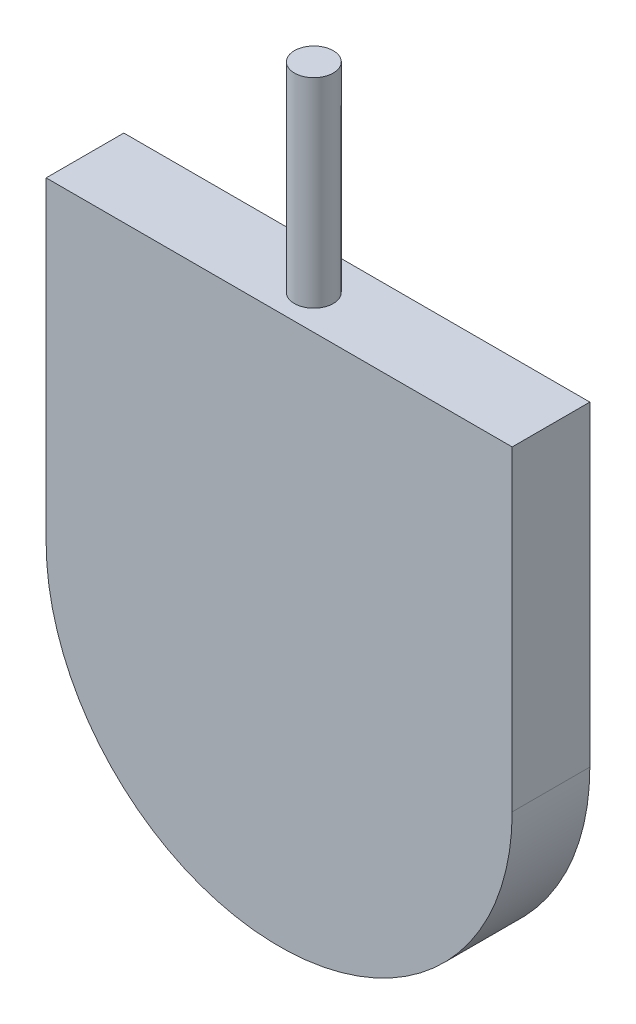
ISO-10303-21;
HEADER;
FILE_DESCRIPTION(('STEP AP214'),'2;1');
FILE_NAME('part.step','',(''),(''),'','','');
FILE_SCHEMA(('AUTOMOTIVE_DESIGN { 1 0 10303 214 1 1 1 1 }'));
ENDSEC;
DATA;
#1=APPLICATION_CONTEXT('core data for automotive mechanical design processes');
#2=APPLICATION_PROTOCOL_DEFINITION('international standard','automotive_design',2000,#1);
#3=PRODUCT_CONTEXT('',#1,'mechanical');
#4=PRODUCT('Part','Part','',(#3));
#5=PRODUCT_RELATED_PRODUCT_CATEGORY('part','',(#4));
#6=PRODUCT_DEFINITION_FORMATION('','',#4);
#7=PRODUCT_DEFINITION_CONTEXT('part definition',#1,'design');
#8=PRODUCT_DEFINITION('design','',#6,#7);
#9=PRODUCT_DEFINITION_SHAPE('','',#8);
#10=(LENGTH_UNIT() NAMED_UNIT(*) SI_UNIT(.MILLI.,.METRE.));
#11=(NAMED_UNIT(*) PLANE_ANGLE_UNIT() SI_UNIT($,.RADIAN.));
#12=(NAMED_UNIT(*) SI_UNIT($,.STERADIAN.) SOLID_ANGLE_UNIT());
#13=UNCERTAINTY_MEASURE_WITH_UNIT(LENGTH_MEASURE(1.E-05),#10,'distance_accuracy_value','');
#14=(GEOMETRIC_REPRESENTATION_CONTEXT(3) GLOBAL_UNCERTAINTY_ASSIGNED_CONTEXT((#13)) GLOBAL_UNIT_ASSIGNED_CONTEXT((#10,
#11,#12)) REPRESENTATION_CONTEXT('',''));
#15=CARTESIAN_POINT('',(0.,0.,0.));
#16=DIRECTION('',(0.,0.,1.));
#17=DIRECTION('',(1.,0.,0.));
#18=AXIS2_PLACEMENT_3D('',#15,#16,#17);
#19=CARTESIAN_POINT('',(0.,0.,12.7));
#20=DIRECTION('',(0.,0.,-1.));
#21=DIRECTION('',(-1.,0.,0.));
#22=AXIS2_PLACEMENT_3D('',#19,#20,#21);
#23=CYLINDRICAL_SURFACE('',#22,38.1);
#24=CARTESIAN_POINT('',(0.,0.,0.));
#25=DIRECTION('',(0.,0.,1.));
#26=DIRECTION('',(1.,0.,0.));
#27=AXIS2_PLACEMENT_3D('',#24,#25,#26);
#28=CIRCLE('',#27,38.1);
#29=CARTESIAN_POINT('',(-38.1,0.,0.));
#30=VERTEX_POINT('',#29);
#31=CARTESIAN_POINT('',(38.1,0.,0.));
#32=VERTEX_POINT('',#31);
#33=EDGE_CURVE('E98',#30,#32,#28,.T.);
#34=ORIENTED_EDGE('',*,*,#33,.T.);
#35=DIRECTION('',(0.,0.,-1.));
#36=VECTOR('',#35,1.);
#37=CARTESIAN_POINT('',(38.1,0.,12.7));
#38=LINE('',#37,#36);
#39=CARTESIAN_POINT('',(38.1,0.,12.7));
#40=VERTEX_POINT('',#39);
#41=EDGE_CURVE('E40',#40,#32,#38,.T.);
#42=ORIENTED_EDGE('',*,*,#41,.F.);
#43=CARTESIAN_POINT('',(0.,0.,12.7));
#44=DIRECTION('',(0.,0.,1.));
#45=DIRECTION('',(1.,0.,0.));
#46=AXIS2_PLACEMENT_3D('',#43,#44,#45);
#47=CIRCLE('',#46,38.1);
#48=CARTESIAN_POINT('',(-38.1,0.,12.7));
#49=VERTEX_POINT('',#48);
#50=EDGE_CURVE('E84',#49,#40,#47,.T.);
#51=ORIENTED_EDGE('',*,*,#50,.F.);
#52=DIRECTION('',(0.,0.,-1.));
#53=VECTOR('',#52,1.);
#54=CARTESIAN_POINT('',(-38.1,0.,12.7));
#55=LINE('',#54,#53);
#56=EDGE_CURVE('E94',#49,#30,#55,.T.);
#57=ORIENTED_EDGE('',*,*,#56,.T.);
#58=EDGE_LOOP('',(#34,#42,#51,#57));
#59=FACE_BOUND('',#58,.T.);
#60=ADVANCED_FACE('F32',(#59),#23,.T.);
#61=CARTESIAN_POINT('',(38.1,51.6824498066954,12.7));
#62=DIRECTION('',(-1.,0.,0.));
#63=DIRECTION('',(0.,0.,1.));
#64=AXIS2_PLACEMENT_3D('',#61,#62,#63);
#65=PLANE('',#64);
#66=DIRECTION('',(0.,1.,0.));
#67=VECTOR('',#66,1.);
#68=CARTESIAN_POINT('',(38.1,51.6824498066954,0.));
#69=LINE('',#68,#67);
#70=CARTESIAN_POINT('',(38.1,51.6824498066954,0.));
#71=VERTEX_POINT('',#70);
#72=EDGE_CURVE('E89',#32,#71,#69,.T.);
#73=ORIENTED_EDGE('',*,*,#72,.T.);
#74=DIRECTION('',(0.,0.,-1.));
#75=VECTOR('',#74,1.);
#76=CARTESIAN_POINT('',(38.1,51.6824498066954,12.7));
#77=LINE('',#76,#75);
#78=CARTESIAN_POINT('',(38.1,51.6824498066954,12.7));
#79=VERTEX_POINT('',#78);
#80=EDGE_CURVE('E87',#79,#71,#77,.T.);
#81=ORIENTED_EDGE('',*,*,#80,.F.);
#82=DIRECTION('',(0.,1.,0.));
#83=VECTOR('',#82,1.);
#84=CARTESIAN_POINT('',(38.1,51.6824498066954,12.7));
#85=LINE('',#84,#83);
#86=EDGE_CURVE('E79',#40,#79,#85,.T.);
#87=ORIENTED_EDGE('',*,*,#86,.F.);
#88=ORIENTED_EDGE('',*,*,#41,.T.);
#89=EDGE_LOOP('',(#73,#81,#87,#88));
#90=FACE_BOUND('',#89,.T.);
#91=ADVANCED_FACE('F88',(#90),#65,.F.);
#92=CARTESIAN_POINT('',(-38.1,51.6824498066954,12.7));
#93=DIRECTION('',(0.,-1.,0.));
#94=DIRECTION('',(0.,0.,-1.));
#95=AXIS2_PLACEMENT_3D('',#92,#93,#94);
#96=PLANE('',#95);
#97=CARTESIAN_POINT('',(0.,51.6824498066954,7.03204627248887));
#98=DIRECTION('',(0.,-1.,0.));
#99=DIRECTION('',(0.,0.,-1.));
#100=AXIS2_PLACEMENT_3D('',#97,#98,#99);
#101=CIRCLE('',#100,3.175);
#102=CARTESIAN_POINT('',(0.,51.6824498066954,3.85704627248887));
#103=VERTEX_POINT('',#102);
#104=EDGE_CURVE('E11',#103,#103,#101,.F.);
#105=ORIENTED_EDGE('',*,*,#104,.F.);
#106=EDGE_LOOP('',(#105));
#107=FACE_BOUND('',#106,.T.);
#108=DIRECTION('',(-1.,0.,0.));
#109=VECTOR('',#108,1.);
#110=CARTESIAN_POINT('',(-38.1,51.6824498066954,0.));
#111=LINE('',#110,#109);
#112=CARTESIAN_POINT('',(-38.1,51.6824498066954,0.));
#113=VERTEX_POINT('',#112);
#114=EDGE_CURVE('E65',#71,#113,#111,.T.);
#115=ORIENTED_EDGE('',*,*,#114,.T.);
#116=DIRECTION('',(0.,0.,-1.));
#117=VECTOR('',#116,1.);
#118=CARTESIAN_POINT('',(-38.1,51.6824498066954,12.7));
#119=LINE('',#118,#117);
#120=CARTESIAN_POINT('',(-38.1,51.6824498066954,12.7));
#121=VERTEX_POINT('',#120);
#122=EDGE_CURVE('E90',#121,#113,#119,.T.);
#123=ORIENTED_EDGE('',*,*,#122,.F.);
#124=DIRECTION('',(-1.,0.,0.));
#125=VECTOR('',#124,1.);
#126=CARTESIAN_POINT('',(-38.1,51.6824498066954,12.7));
#127=LINE('',#126,#125);
#128=EDGE_CURVE('E82',#79,#121,#127,.T.);
#129=ORIENTED_EDGE('',*,*,#128,.F.);
#130=ORIENTED_EDGE('',*,*,#80,.T.);
#131=EDGE_LOOP('',(#115,#123,#129,#130));
#132=FACE_BOUND('',#131,.T.);
#133=ADVANCED_FACE('F92',(#107,#132),#96,.F.);
#134=CARTESIAN_POINT('',(-38.1,0.,12.7));
#135=DIRECTION('',(1.,0.,0.));
#136=DIRECTION('',(0.,0.,-1.));
#137=AXIS2_PLACEMENT_3D('',#134,#135,#136);
#138=PLANE('',#137);
#139=DIRECTION('',(0.,-1.,0.));
#140=VECTOR('',#139,1.);
#141=CARTESIAN_POINT('',(-38.1,0.,0.));
#142=LINE('',#141,#140);
#143=EDGE_CURVE('E71',#113,#30,#142,.T.);
#144=ORIENTED_EDGE('',*,*,#143,.T.);
#145=ORIENTED_EDGE('',*,*,#56,.F.);
#146=DIRECTION('',(0.,-1.,0.));
#147=VECTOR('',#146,1.);
#148=CARTESIAN_POINT('',(-38.1,0.,12.7));
#149=LINE('',#148,#147);
#150=EDGE_CURVE('E48',#121,#49,#149,.T.);
#151=ORIENTED_EDGE('',*,*,#150,.F.);
#152=ORIENTED_EDGE('',*,*,#122,.T.);
#153=EDGE_LOOP('',(#144,#145,#151,#152));
#154=FACE_BOUND('',#153,.T.);
#155=ADVANCED_FACE('F120',(#154),#138,.F.);
#156=CARTESIAN_POINT('',(0.,0.,12.7));
#157=DIRECTION('',(0.,0.,1.));
#158=DIRECTION('',(1.,0.,0.));
#159=AXIS2_PLACEMENT_3D('',#156,#157,#158);
#160=PLANE('',#159);
#161=ORIENTED_EDGE('',*,*,#50,.T.);
#162=ORIENTED_EDGE('',*,*,#86,.T.);
#163=ORIENTED_EDGE('',*,*,#128,.T.);
#164=ORIENTED_EDGE('',*,*,#150,.T.);
#165=EDGE_LOOP('',(#161,#162,#163,#164));
#166=FACE_BOUND('',#165,.T.);
#167=ADVANCED_FACE('F80',(#166),#160,.T.);
#168=CARTESIAN_POINT('',(0.,0.,0.));
#169=DIRECTION('',(0.,0.,1.));
#170=DIRECTION('',(1.,0.,0.));
#171=AXIS2_PLACEMENT_3D('',#168,#169,#170);
#172=PLANE('',#171);
#173=ORIENTED_EDGE('',*,*,#33,.F.);
#174=ORIENTED_EDGE('',*,*,#143,.F.);
#175=ORIENTED_EDGE('',*,*,#114,.F.);
#176=ORIENTED_EDGE('',*,*,#72,.F.);
#177=EDGE_LOOP('',(#173,#174,#175,#176));
#178=FACE_BOUND('',#177,.T.);
#179=ADVANCED_FACE('F109',(#178),#172,.F.);
#180=CARTESIAN_POINT('',(0.,84.328,7.03204627248887));
#181=DIRECTION('',(0.,-1.,0.));
#182=DIRECTION('',(0.,0.,-1.));
#183=AXIS2_PLACEMENT_3D('',#180,#181,#182);
#184=CYLINDRICAL_SURFACE('',#183,3.175);
#185=CARTESIAN_POINT('',(0.,84.328,7.03204627248887));
#186=DIRECTION('',(0.,1.,0.));
#187=DIRECTION('',(0.,0.,1.));
#188=AXIS2_PLACEMENT_3D('',#185,#186,#187);
#189=CIRCLE('',#188,3.175);
#190=CARTESIAN_POINT('',(0.,84.328,3.85704627248887));
#191=VERTEX_POINT('',#190);
#192=EDGE_CURVE('E101',#191,#191,#189,.T.);
#193=CARTESIAN_POINT('',(0.,84.328,3.85704627248887));
#194=CARTESIAN_POINT('',(0.,83.9879421854864,3.85704627248887));
#195=CARTESIAN_POINT('',(0.,83.6478843709728,3.85704627248887));
#196=CARTESIAN_POINT('',(0.,82.9677687419457,3.85704627248887));
#197=CARTESIAN_POINT('',(0.,82.627710927432,3.85704627248887));
#198=CARTESIAN_POINT('',(0.,81.9475952984049,3.85704627248887));
#199=CARTESIAN_POINT('',(0.,81.6075374838913,3.85704627248887));
#200=CARTESIAN_POINT('',(0.,80.9274218548641,3.85704627248887));
#201=CARTESIAN_POINT('',(0.,80.5873640403505,3.85704627248887));
#202=CARTESIAN_POINT('',(0.,79.9072484113234,3.85704627248887));
#203=CARTESIAN_POINT('',(0.,79.5671905968098,3.85704627248887));
#204=CARTESIAN_POINT('',(0.,78.8870749677826,3.85704627248887));
#205=CARTESIAN_POINT('',(0.,78.547017153269,3.85704627248887));
#206=CARTESIAN_POINT('',(0.,77.8669015242418,3.85704627248887));
#207=CARTESIAN_POINT('',(0.,77.5268437097282,3.85704627248887));
#208=CARTESIAN_POINT('',(0.,76.846728080701,3.85704627248887));
#209=CARTESIAN_POINT('',(0.,76.5066702661874,3.85704627248887));
#210=CARTESIAN_POINT('',(0.,75.8265546371603,3.85704627248887));
#211=CARTESIAN_POINT('',(0.,75.4864968226467,3.85704627248887));
#212=CARTESIAN_POINT('',(0.,74.8063811936195,3.85704627248887));
#213=CARTESIAN_POINT('',(0.,74.4663233791059,3.85704627248887));
#214=CARTESIAN_POINT('',(0.,73.7862077500787,3.85704627248887));
#215=CARTESIAN_POINT('',(0.,73.4461499355651,3.85704627248887));
#216=CARTESIAN_POINT('',(0.,72.766034306538,3.85704627248887));
#217=CARTESIAN_POINT('',(0.,72.4259764920244,3.85704627248887));
#218=CARTESIAN_POINT('',(0.,71.7458608629972,3.85704627248887));
#219=CARTESIAN_POINT('',(0.,71.4058030484836,3.85704627248887));
#220=CARTESIAN_POINT('',(0.,70.7256874194564,3.85704627248887));
#221=CARTESIAN_POINT('',(0.,70.3856296049428,3.85704627248887));
#222=CARTESIAN_POINT('',(0.,69.7055139759157,3.85704627248887));
#223=CARTESIAN_POINT('',(0.,69.3654561614021,3.85704627248887));
#224=CARTESIAN_POINT('',(0.,68.6853405323749,3.85704627248887));
#225=CARTESIAN_POINT('',(0.,68.3452827178613,3.85704627248887));
#226=CARTESIAN_POINT('',(0.,67.6651670888341,3.85704627248887));
#227=CARTESIAN_POINT('',(0.,67.3251092743205,3.85704627248887));
#228=CARTESIAN_POINT('',(0.,66.6449936452933,3.85704627248887));
#229=CARTESIAN_POINT('',(0.,66.3049358307797,3.85704627248887));
#230=CARTESIAN_POINT('',(0.,65.6248202017526,3.85704627248887));
#231=CARTESIAN_POINT('',(0.,65.284762387239,3.85704627248887));
#232=CARTESIAN_POINT('',(0.,64.6046467582118,3.85704627248887));
#233=CARTESIAN_POINT('',(0.,64.2645889436982,3.85704627248887));
#234=CARTESIAN_POINT('',(0.,63.584473314671,3.85704627248887));
#235=CARTESIAN_POINT('',(0.,63.2444155001574,3.85704627248887));
#236=CARTESIAN_POINT('',(0.,62.5642998711303,3.85704627248887));
#237=CARTESIAN_POINT('',(0.,62.2242420566167,3.85704627248887));
#238=CARTESIAN_POINT('',(0.,61.5441264275895,3.85704627248887));
#239=CARTESIAN_POINT('',(0.,61.2040686130759,3.85704627248887));
#240=CARTESIAN_POINT('',(0.,60.5239529840487,3.85704627248887));
#241=CARTESIAN_POINT('',(0.,60.1838951695351,3.85704627248887));
#242=CARTESIAN_POINT('',(0.,59.503779540508,3.85704627248887));
#243=CARTESIAN_POINT('',(0.,59.1637217259944,3.85704627248887));
#244=CARTESIAN_POINT('',(0.,58.4836060969672,3.85704627248887));
#245=CARTESIAN_POINT('',(0.,58.1435482824536,3.85704627248887));
#246=CARTESIAN_POINT('',(0.,57.4634326534264,3.85704627248887));
#247=CARTESIAN_POINT('',(0.,57.1233748389128,3.85704627248887));
#248=CARTESIAN_POINT('',(0.,56.4432592098857,3.85704627248887));
#249=CARTESIAN_POINT('',(0.,56.1032013953721,3.85704627248887));
#250=CARTESIAN_POINT('',(0.,55.4230857663449,3.85704627248887));
#251=CARTESIAN_POINT('',(0.,55.0830279518313,3.85704627248887));
#252=CARTESIAN_POINT('',(0.,54.4029123228041,3.85704627248887));
#253=CARTESIAN_POINT('',(0.,54.0628545082905,3.85704627248887));
#254=CARTESIAN_POINT('',(0.,53.3827388792633,3.85704627248887));
#255=CARTESIAN_POINT('',(0.,53.0426810647498,3.85704627248887));
#256=CARTESIAN_POINT('',(0.,52.3625654357226,3.85704627248887));
#257=CARTESIAN_POINT('',(0.,52.022507621209,3.85704627248887));
#258=CARTESIAN_POINT('',(0.,51.6824498066954,3.85704627248887));
#259=B_SPLINE_CURVE_WITH_KNOTS('',3,(#193,#194,#195,#196,#197,#198,#199,#200,#201,#202,#203,
#204,#205,#206,#207,#208,#209,#210,#211,#212,#213,#214,#215,#216,#217,#218,#219,#220,#221,#222,
#223,#224,#225,#226,#227,#228,#229,#230,#231,#232,#233,#234,#235,#236,#237,#238,#239,#240,#241,
#242,#243,#244,#245,#246,#247,#248,#249,#250,#251,#252,#253,#254,#255,#256,#257,#258),
.UNSPECIFIED.,.F.,.F.,(4,2,2,2,2,2,2,2,2,2,2,2,2,2,2,2,2,2,2,2,2,2,2,2,2,2,2,2,2,2,2,2,4),(0.,
1.02017344354077,2.04034688708155,3.06052033062232,4.08069377416308,5.10086721770385,
6.12104066124462,7.1412141047854,8.16138754832615,9.18156099186693,10.2017344354077,
11.2219078789485,12.2420813224892,13.26225476603,14.2824282095708,15.3026016531115,
16.3227750966523,17.3429485401931,18.3631219837339,19.3832954272746,20.4034688708154,
21.4236423143562,22.4438157578969,23.4639892014377,24.4841626449785,25.5043360885192,
26.52450953206,27.5446829756008,28.5648564191415,29.5850298626823,30.6052033062231,
31.6253767497638,32.6455501933046),.UNSPECIFIED.);
#260=EDGE_CURVE('BSEAM111',#191,#103,#259,.T.);
#261=ORIENTED_EDGE('',*,*,#192,.F.);
#262=ORIENTED_EDGE('',*,*,#104,.T.);
#263=ORIENTED_EDGE('',*,*,#260,.T.);
#264=ORIENTED_EDGE('',*,*,#260,.F.);
#265=EDGE_LOOP('',(#261,#263,#262,#264));
#266=FACE_BOUND('',#265,.T.);
#267=ADVANCED_FACE('F111',(#266),#184,.T.);
#268=CARTESIAN_POINT('',(0.,84.328,7.03204627248887));
#269=DIRECTION('',(0.,1.,0.));
#270=DIRECTION('',(0.,0.,1.));
#271=AXIS2_PLACEMENT_3D('',#268,#269,#270);
#272=PLANE('',#271);
#273=ORIENTED_EDGE('',*,*,#192,.T.);
#274=EDGE_LOOP('',(#273));
#275=FACE_BOUND('',#274,.T.);
#276=ADVANCED_FACE('F117',(#275),#272,.T.);
#277=CLOSED_SHELL('',(#60,#91,#133,#155,#167,#179,#267,#276));
#278=MANIFOLD_SOLID_BREP('B2',#277);
#279=ADVANCED_BREP_SHAPE_REPRESENTATION('',(#18,#278),#14);
#280=SHAPE_DEFINITION_REPRESENTATION(#9,#279);
ENDSEC;
END-ISO-10303-21;
